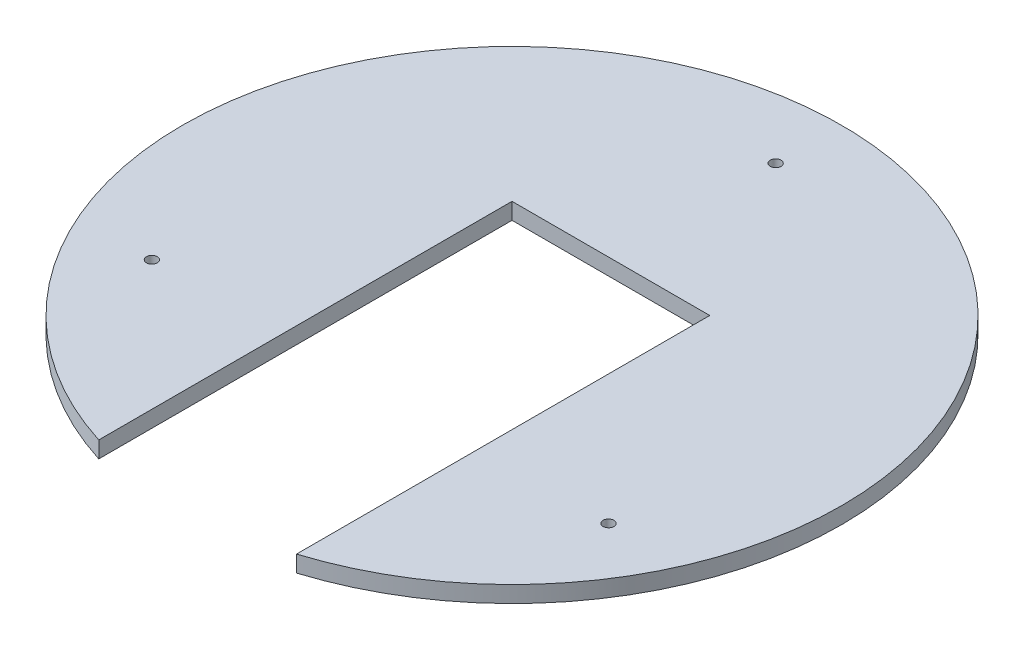
ISO-10303-21;
HEADER;
FILE_DESCRIPTION(('STEP AP214'),'2;1');
FILE_NAME('part.step','',(''),(''),'','','');
FILE_SCHEMA(('AUTOMOTIVE_DESIGN { 1 0 10303 214 1 1 1 1 }'));
ENDSEC;
DATA;
#1=APPLICATION_CONTEXT('core data for automotive mechanical design processes');
#2=APPLICATION_PROTOCOL_DEFINITION('international standard','automotive_design',2000,#1);
#3=PRODUCT_CONTEXT('',#1,'mechanical');
#4=PRODUCT('Part','Part','',(#3));
#5=PRODUCT_RELATED_PRODUCT_CATEGORY('part','',(#4));
#6=PRODUCT_DEFINITION_FORMATION('','',#4);
#7=PRODUCT_DEFINITION_CONTEXT('part definition',#1,'design');
#8=PRODUCT_DEFINITION('design','',#6,#7);
#9=PRODUCT_DEFINITION_SHAPE('','',#8);
#10=(LENGTH_UNIT() NAMED_UNIT(*) SI_UNIT(.MILLI.,.METRE.));
#11=(NAMED_UNIT(*) PLANE_ANGLE_UNIT() SI_UNIT($,.RADIAN.));
#12=(NAMED_UNIT(*) SI_UNIT($,.STERADIAN.) SOLID_ANGLE_UNIT());
#13=UNCERTAINTY_MEASURE_WITH_UNIT(LENGTH_MEASURE(1.E-05),#10,'distance_accuracy_value','');
#14=(GEOMETRIC_REPRESENTATION_CONTEXT(3) GLOBAL_UNCERTAINTY_ASSIGNED_CONTEXT((#13)) GLOBAL_UNIT_ASSIGNED_CONTEXT((#10,
#11,#12)) REPRESENTATION_CONTEXT('',''));
#15=CARTESIAN_POINT('',(0.,0.,0.));
#16=DIRECTION('',(0.,0.,1.));
#17=DIRECTION('',(1.,0.,0.));
#18=AXIS2_PLACEMENT_3D('',#15,#16,#17);
#19=CARTESIAN_POINT('',(0.,0.,0.));
#20=DIRECTION('',(0.,1.,0.));
#21=DIRECTION('',(0.,0.,1.));
#22=AXIS2_PLACEMENT_3D('',#19,#20,#21);
#23=PLANE('',#22);
#24=CARTESIAN_POINT('',(0.,0.,-101.6));
#25=DIRECTION('',(0.,1.,0.));
#26=DIRECTION('',(0.,0.,1.));
#27=AXIS2_PLACEMENT_3D('',#24,#25,#26);
#28=CIRCLE('',#27,4.9275999999446);
#29=CARTESIAN_POINT('',(0.,0.,-96.6724000000554));
#30=VERTEX_POINT('',#29);
#31=EDGE_CURVE('E19',#30,#30,#28,.T.);
#32=ORIENTED_EDGE('',*,*,#31,.T.);
#33=EDGE_LOOP('',(#32));
#34=FACE_BOUND('',#33,.T.);
#35=CARTESIAN_POINT('',(87.9881810245052,1.52311481786158E-11,50.8));
#36=DIRECTION('',(0.,-1.,0.));
#37=DIRECTION('',(0.,0.,-1.));
#38=AXIS2_PLACEMENT_3D('',#35,#36,#37);
#39=CIRCLE('',#38,4.92759999999252);
#40=CARTESIAN_POINT('',(87.9881810245052,1.52311481786158E-11,45.8724000000075));
#41=VERTEX_POINT('',#40);
#42=EDGE_CURVE('E120',#41,#41,#39,.F.);
#43=ORIENTED_EDGE('',*,*,#42,.T.);
#44=EDGE_LOOP('',(#43));
#45=FACE_BOUND('',#44,.T.);
#46=CARTESIAN_POINT('',(-87.9881810245052,0.,50.8));
#47=DIRECTION('',(0.,-1.,0.));
#48=DIRECTION('',(0.,0.,-1.));
#49=AXIS2_PLACEMENT_3D('',#46,#47,#48);
#50=CIRCLE('',#49,4.92759999993568);
#51=CARTESIAN_POINT('',(-87.9881810245052,0.,45.8724000000643));
#52=VERTEX_POINT('',#51);
#53=EDGE_CURVE('E102',#52,#52,#50,.F.);
#54=ORIENTED_EDGE('',*,*,#53,.T.);
#55=EDGE_LOOP('',(#54));
#56=FACE_BOUND('',#55,.T.);
#57=CARTESIAN_POINT('',(0.,0.,0.));
#58=DIRECTION('',(0.,1.,0.));
#59=DIRECTION('',(0.,0.,1.));
#60=AXIS2_PLACEMENT_3D('',#57,#58,#59);
#61=CIRCLE('',#60,127.);
#62=CARTESIAN_POINT('',(38.099999999999,0.,121.150278579952));
#63=VERTEX_POINT('',#62);
#64=CARTESIAN_POINT('',(-38.1,0.,121.150278579956));
#65=VERTEX_POINT('',#64);
#66=EDGE_CURVE('E91',#63,#65,#61,.T.);
#67=ORIENTED_EDGE('',*,*,#66,.F.);
#68=DIRECTION('',(0.,0.,-1.));
#69=VECTOR('',#68,1.);
#70=CARTESIAN_POINT('',(38.1,0.,-38.1));
#71=LINE('',#70,#69);
#72=CARTESIAN_POINT('',(38.1,0.,-38.1));
#73=VERTEX_POINT('',#72);
#74=EDGE_CURVE('E71',#63,#73,#71,.T.);
#75=ORIENTED_EDGE('',*,*,#74,.T.);
#76=DIRECTION('',(-1.,0.,0.));
#77=VECTOR('',#76,1.);
#78=CARTESIAN_POINT('',(-38.1,0.,-38.1));
#79=LINE('',#78,#77);
#80=CARTESIAN_POINT('',(-38.1,0.,-38.1));
#81=VERTEX_POINT('',#80);
#82=EDGE_CURVE('E56',#73,#81,#79,.T.);
#83=ORIENTED_EDGE('',*,*,#82,.T.);
#84=DIRECTION('',(0.,0.,1.));
#85=VECTOR('',#84,1.);
#86=CARTESIAN_POINT('',(-38.1,0.,142.557146436089));
#87=LINE('',#86,#85);
#88=EDGE_CURVE('E50',#81,#65,#87,.T.);
#89=ORIENTED_EDGE('',*,*,#88,.T.);
#90=EDGE_LOOP('',(#67,#75,#83,#89));
#91=FACE_BOUND('',#90,.T.);
#92=ADVANCED_FACE('F16',(#34,#45,#56,#91),#23,.F.);
#93=CARTESIAN_POINT('',(0.,-0.00986939227232142,-101.6));
#94=DIRECTION('',(0.,-1.,0.));
#95=DIRECTION('',(0.,0.,-1.));
#96=AXIS2_PLACEMENT_3D('',#93,#94,#95);
#97=CONICAL_SURFACE('',#96,4.94469428880021,1.04719755119955);
#98=CARTESIAN_POINT('',(0.,1.6424460457907,-101.6));
#99=DIRECTION('',(0.,-1.,0.));
#100=DIRECTION('',(0.,0.,-1.));
#101=AXIS2_PLACEMENT_3D('',#98,#99,#100);
#102=CIRCLE('',#101,2.0828);
#103=CARTESIAN_POINT('',(0.,1.6424460457907,-103.6828));
#104=VERTEX_POINT('',#103);
#105=EDGE_CURVE('E97',#104,#104,#102,.F.);
#106=ORIENTED_EDGE('',*,*,#105,.T.);
#107=EDGE_LOOP('',(#106));
#108=FACE_BOUND('',#107,.T.);
#109=ORIENTED_EDGE('',*,*,#31,.F.);
#110=EDGE_LOOP('',(#109));
#111=FACE_BOUND('',#110,.T.);
#112=ADVANCED_FACE('F128',(#108,#111),#97,.F.);
#113=CARTESIAN_POINT('',(87.9881810245052,1.13686837721616E-10,50.8));
#114=DIRECTION('',(0.,-1.,0.));
#115=DIRECTION('',(0.,0.,-1.));
#116=AXIS2_PLACEMENT_3D('',#113,#114,#115);
#117=CONICAL_SURFACE('',#116,4.92759999982199,1.04719755119589);
#118=CARTESIAN_POINT('',(87.9881810245052,1.64244604579095,50.8));
#119=DIRECTION('',(0.,-1.,0.));
#120=DIRECTION('',(0.,0.,-1.));
#121=AXIS2_PLACEMENT_3D('',#118,#119,#120);
#122=CIRCLE('',#121,2.0828);
#123=CARTESIAN_POINT('',(87.9881810245052,1.64244604579095,48.7172));
#124=VERTEX_POINT('',#123);
#125=EDGE_CURVE('E83',#124,#124,#122,.F.);
#126=ORIENTED_EDGE('',*,*,#125,.T.);
#127=EDGE_LOOP('',(#126));
#128=FACE_BOUND('',#127,.T.);
#129=ORIENTED_EDGE('',*,*,#42,.F.);
#130=EDGE_LOOP('',(#129));
#131=FACE_BOUND('',#130,.T.);
#132=ADVANCED_FACE('F130',(#128,#131),#117,.F.);
#133=CARTESIAN_POINT('',(-87.9881810245052,0.,50.8));
#134=DIRECTION('',(0.,-1.,0.));
#135=DIRECTION('',(0.,0.,-1.));
#136=AXIS2_PLACEMENT_3D('',#133,#134,#135);
#137=CONICAL_SURFACE('',#136,4.92759999993568,1.0471975511809);
#138=CARTESIAN_POINT('',(-87.9881810245052,1.6424460457907,50.8));
#139=DIRECTION('',(0.,-1.,0.));
#140=DIRECTION('',(0.,0.,-1.));
#141=AXIS2_PLACEMENT_3D('',#138,#139,#140);
#142=CIRCLE('',#141,2.0828);
#143=CARTESIAN_POINT('',(-87.9881810245052,1.6424460457907,48.7172));
#144=VERTEX_POINT('',#143);
#145=EDGE_CURVE('E80',#144,#144,#142,.F.);
#146=ORIENTED_EDGE('',*,*,#145,.T.);
#147=EDGE_LOOP('',(#146));
#148=FACE_BOUND('',#147,.T.);
#149=ORIENTED_EDGE('',*,*,#53,.F.);
#150=EDGE_LOOP('',(#149));
#151=FACE_BOUND('',#150,.T.);
#152=ADVANCED_FACE('F137',(#148,#151),#137,.F.);
#153=CARTESIAN_POINT('',(-38.1,0.,-38.1));
#154=DIRECTION('',(0.,0.,-1.));
#155=DIRECTION('',(-1.,0.,0.));
#156=AXIS2_PLACEMENT_3D('',#153,#154,#155);
#157=PLANE('',#156);
#158=DIRECTION('',(1.,0.,0.));
#159=VECTOR('',#158,1.);
#160=CARTESIAN_POINT('',(0.,6.35,-38.1));
#161=LINE('',#160,#159);
#162=CARTESIAN_POINT('',(-38.1,6.35,-38.1));
#163=VERTEX_POINT('',#162);
#164=CARTESIAN_POINT('',(38.1,6.35,-38.1));
#165=VERTEX_POINT('',#164);
#166=EDGE_CURVE('E66',#163,#165,#161,.T.);
#167=ORIENTED_EDGE('',*,*,#166,.F.);
#168=DIRECTION('',(0.,1.,0.));
#169=VECTOR('',#168,1.);
#170=CARTESIAN_POINT('',(-38.1,0.,-38.1));
#171=LINE('',#170,#169);
#172=EDGE_CURVE('E100',#163,#81,#171,.F.);
#173=ORIENTED_EDGE('',*,*,#172,.T.);
#174=ORIENTED_EDGE('',*,*,#82,.F.);
#175=DIRECTION('',(0.,1.,0.));
#176=VECTOR('',#175,1.);
#177=CARTESIAN_POINT('',(38.1,0.,-38.1));
#178=LINE('',#177,#176);
#179=EDGE_CURVE('E62',#73,#165,#178,.T.);
#180=ORIENTED_EDGE('',*,*,#179,.T.);
#181=EDGE_LOOP('',(#167,#173,#174,#180));
#182=FACE_BOUND('',#181,.T.);
#183=ADVANCED_FACE('F64',(#182),#157,.F.);
#184=CARTESIAN_POINT('',(38.1,0.,-38.1));
#185=DIRECTION('',(1.,0.,0.));
#186=DIRECTION('',(0.,0.,-1.));
#187=AXIS2_PLACEMENT_3D('',#184,#185,#186);
#188=PLANE('',#187);
#189=DIRECTION('',(0.,0.,1.));
#190=VECTOR('',#189,1.);
#191=CARTESIAN_POINT('',(38.1,6.35,0.));
#192=LINE('',#191,#190);
#193=CARTESIAN_POINT('',(38.099999999999,6.35,121.150278579952));
#194=VERTEX_POINT('',#193);
#195=EDGE_CURVE('E73',#165,#194,#192,.T.);
#196=ORIENTED_EDGE('',*,*,#195,.F.);
#197=ORIENTED_EDGE('',*,*,#179,.F.);
#198=ORIENTED_EDGE('',*,*,#74,.F.);
#199=DIRECTION('',(0.,1.,0.));
#200=VECTOR('',#199,1.);
#201=CARTESIAN_POINT('',(38.099999999998,0.,121.150278579953));
#202=LINE('',#201,#200);
#203=EDGE_CURVE('E70',#194,#63,#202,.F.);
#204=ORIENTED_EDGE('',*,*,#203,.F.);
#205=EDGE_LOOP('',(#196,#197,#198,#204));
#206=FACE_BOUND('',#205,.T.);
#207=ADVANCED_FACE('F74',(#206),#188,.F.);
#208=CARTESIAN_POINT('',(0.,0.,0.));
#209=DIRECTION('',(0.,1.,0.));
#210=DIRECTION('',(0.,0.,1.));
#211=AXIS2_PLACEMENT_3D('',#208,#209,#210);
#212=CYLINDRICAL_SURFACE('',#211,127.);
#213=ORIENTED_EDGE('',*,*,#203,.T.);
#214=ORIENTED_EDGE('',*,*,#66,.T.);
#215=DIRECTION('',(0.,1.,0.));
#216=VECTOR('',#215,1.);
#217=CARTESIAN_POINT('',(-38.1,0.,121.150278579959));
#218=LINE('',#217,#216);
#219=CARTESIAN_POINT('',(-38.1,6.35,121.150278579956));
#220=VERTEX_POINT('',#219);
#221=EDGE_CURVE('E106',#65,#220,#218,.T.);
#222=ORIENTED_EDGE('',*,*,#221,.T.);
#223=CARTESIAN_POINT('',(0.,6.35,0.));
#224=DIRECTION('',(0.,1.,0.));
#225=DIRECTION('',(0.,0.,1.));
#226=AXIS2_PLACEMENT_3D('',#223,#224,#225);
#227=CIRCLE('',#226,127.);
#228=EDGE_CURVE('E34',#194,#220,#227,.T.);
#229=ORIENTED_EDGE('',*,*,#228,.F.);
#230=EDGE_LOOP('',(#213,#214,#222,#229));
#231=FACE_BOUND('',#230,.T.);
#232=ADVANCED_FACE('F162',(#231),#212,.T.);
#233=CARTESIAN_POINT('',(-38.1,0.,142.557146436089));
#234=DIRECTION('',(-1.,0.,0.));
#235=DIRECTION('',(0.,0.,1.));
#236=AXIS2_PLACEMENT_3D('',#233,#234,#235);
#237=PLANE('',#236);
#238=DIRECTION('',(0.,0.,1.));
#239=VECTOR('',#238,1.);
#240=CARTESIAN_POINT('',(-38.1,6.35,0.));
#241=LINE('',#240,#239);
#242=EDGE_CURVE('E79',#220,#163,#241,.F.);
#243=ORIENTED_EDGE('',*,*,#242,.F.);
#244=ORIENTED_EDGE('',*,*,#221,.F.);
#245=ORIENTED_EDGE('',*,*,#88,.F.);
#246=ORIENTED_EDGE('',*,*,#172,.F.);
#247=EDGE_LOOP('',(#243,#244,#245,#246));
#248=FACE_BOUND('',#247,.T.);
#249=ADVANCED_FACE('F158',(#248),#237,.F.);
#250=CARTESIAN_POINT('',(0.,0.,-101.6));
#251=DIRECTION('',(0.,-1.,0.));
#252=DIRECTION('',(0.,0.,-1.));
#253=AXIS2_PLACEMENT_3D('',#250,#251,#252);
#254=CYLINDRICAL_SURFACE('',#253,2.0828);
#255=CARTESIAN_POINT('',(0.,6.35,-101.6));
#256=DIRECTION('',(0.,-1.,0.));
#257=DIRECTION('',(0.,0.,-1.));
#258=AXIS2_PLACEMENT_3D('',#255,#256,#257);
#259=CIRCLE('',#258,2.0828);
#260=CARTESIAN_POINT('',(0.,6.35,-103.6828));
#261=VERTEX_POINT('',#260);
#262=EDGE_CURVE('E114',#261,#261,#259,.T.);
#263=ORIENTED_EDGE('',*,*,#262,.F.);
#264=EDGE_LOOP('',(#263));
#265=FACE_BOUND('',#264,.T.);
#266=ORIENTED_EDGE('',*,*,#105,.F.);
#267=EDGE_LOOP('',(#266));
#268=FACE_BOUND('',#267,.T.);
#269=ADVANCED_FACE('F154',(#265,#268),#254,.F.);
#270=CARTESIAN_POINT('',(87.9881810245052,0.,50.8));
#271=DIRECTION('',(0.,-1.,0.));
#272=DIRECTION('',(0.,0.,-1.));
#273=AXIS2_PLACEMENT_3D('',#270,#271,#272);
#274=CYLINDRICAL_SURFACE('',#273,2.0828);
#275=CARTESIAN_POINT('',(87.9881810245052,6.35,50.8));
#276=DIRECTION('',(0.,-1.,0.));
#277=DIRECTION('',(0.,0.,-1.));
#278=AXIS2_PLACEMENT_3D('',#275,#276,#277);
#279=CIRCLE('',#278,2.0828);
#280=CARTESIAN_POINT('',(87.9881810245052,6.35,48.7172));
#281=VERTEX_POINT('',#280);
#282=EDGE_CURVE('E25',#281,#281,#279,.T.);
#283=ORIENTED_EDGE('',*,*,#282,.F.);
#284=EDGE_LOOP('',(#283));
#285=FACE_BOUND('',#284,.T.);
#286=ORIENTED_EDGE('',*,*,#125,.F.);
#287=EDGE_LOOP('',(#286));
#288=FACE_BOUND('',#287,.T.);
#289=ADVANCED_FACE('F147',(#285,#288),#274,.F.);
#290=CARTESIAN_POINT('',(-87.9881810245052,0.,50.8));
#291=DIRECTION('',(0.,-1.,0.));
#292=DIRECTION('',(0.,0.,-1.));
#293=AXIS2_PLACEMENT_3D('',#290,#291,#292);
#294=CYLINDRICAL_SURFACE('',#293,2.0828);
#295=CARTESIAN_POINT('',(-87.9881810245052,6.35,50.8));
#296=DIRECTION('',(0.,-1.,0.));
#297=DIRECTION('',(0.,0.,-1.));
#298=AXIS2_PLACEMENT_3D('',#295,#296,#297);
#299=CIRCLE('',#298,2.0828);
#300=CARTESIAN_POINT('',(-87.9881810245052,6.35,48.7172));
#301=VERTEX_POINT('',#300);
#302=EDGE_CURVE('E11',#301,#301,#299,.T.);
#303=ORIENTED_EDGE('',*,*,#302,.F.);
#304=EDGE_LOOP('',(#303));
#305=FACE_BOUND('',#304,.T.);
#306=ORIENTED_EDGE('',*,*,#145,.F.);
#307=EDGE_LOOP('',(#306));
#308=FACE_BOUND('',#307,.T.);
#309=ADVANCED_FACE('F141',(#305,#308),#294,.F.);
#310=CARTESIAN_POINT('',(0.,6.35,0.));
#311=DIRECTION('',(0.,1.,0.));
#312=DIRECTION('',(0.,0.,1.));
#313=AXIS2_PLACEMENT_3D('',#310,#311,#312);
#314=PLANE('',#313);
#315=ORIENTED_EDGE('',*,*,#302,.T.);
#316=EDGE_LOOP('',(#315));
#317=FACE_BOUND('',#316,.T.);
#318=ORIENTED_EDGE('',*,*,#282,.T.);
#319=EDGE_LOOP('',(#318));
#320=FACE_BOUND('',#319,.T.);
#321=ORIENTED_EDGE('',*,*,#262,.T.);
#322=EDGE_LOOP('',(#321));
#323=FACE_BOUND('',#322,.T.);
#324=ORIENTED_EDGE('',*,*,#228,.T.);
#325=ORIENTED_EDGE('',*,*,#242,.T.);
#326=ORIENTED_EDGE('',*,*,#166,.T.);
#327=ORIENTED_EDGE('',*,*,#195,.T.);
#328=EDGE_LOOP('',(#324,#325,#326,#327));
#329=FACE_BOUND('',#328,.T.);
#330=ADVANCED_FACE('F77',(#317,#320,#323,#329),#314,.T.);
#331=CLOSED_SHELL('',(#92,#112,#132,#152,#183,#207,#232,#249,#269,#289,#309,#330));
#332=MANIFOLD_SOLID_BREP('B1',#331);
#333=ADVANCED_BREP_SHAPE_REPRESENTATION('',(#18,#332),#14);
#334=SHAPE_DEFINITION_REPRESENTATION(#9,#333);
ENDSEC;
END-ISO-10303-21;
